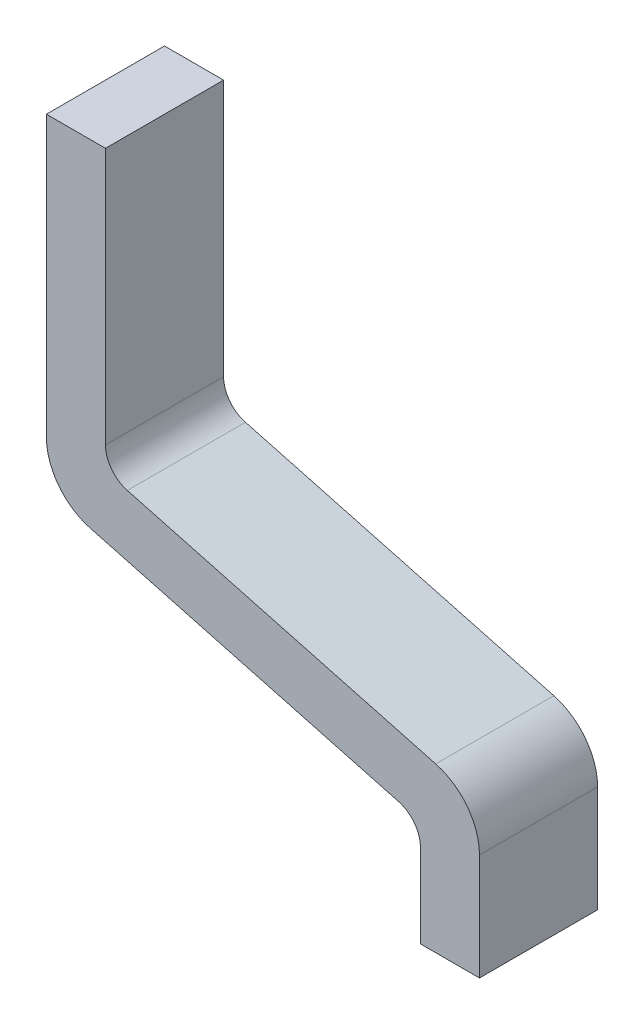
ISO-10303-21;
HEADER;
FILE_DESCRIPTION(('STEP AP214'),'2;1');
FILE_NAME('part.step','',(''),(''),'','','');
FILE_SCHEMA(('AUTOMOTIVE_DESIGN { 1 0 10303 214 1 1 1 1 }'));
ENDSEC;
DATA;
#1=APPLICATION_CONTEXT('core data for automotive mechanical design processes');
#2=APPLICATION_PROTOCOL_DEFINITION('international standard','automotive_design',2000,#1);
#3=PRODUCT_CONTEXT('',#1,'mechanical');
#4=PRODUCT('Part','Part','',(#3));
#5=PRODUCT_RELATED_PRODUCT_CATEGORY('part','',(#4));
#6=PRODUCT_DEFINITION_FORMATION('','',#4);
#7=PRODUCT_DEFINITION_CONTEXT('part definition',#1,'design');
#8=PRODUCT_DEFINITION('design','',#6,#7);
#9=PRODUCT_DEFINITION_SHAPE('','',#8);
#10=(LENGTH_UNIT() NAMED_UNIT(*) SI_UNIT(.MILLI.,.METRE.));
#11=(NAMED_UNIT(*) PLANE_ANGLE_UNIT() SI_UNIT($,.RADIAN.));
#12=(NAMED_UNIT(*) SI_UNIT($,.STERADIAN.) SOLID_ANGLE_UNIT());
#13=UNCERTAINTY_MEASURE_WITH_UNIT(LENGTH_MEASURE(1.E-05),#10,'distance_accuracy_value','');
#14=(GEOMETRIC_REPRESENTATION_CONTEXT(3) GLOBAL_UNCERTAINTY_ASSIGNED_CONTEXT((#13)) GLOBAL_UNIT_ASSIGNED_CONTEXT((#10,
#11,#12)) REPRESENTATION_CONTEXT('',''));
#15=CARTESIAN_POINT('',(0.,0.,0.));
#16=DIRECTION('',(0.,0.,1.));
#17=DIRECTION('',(1.,0.,0.));
#18=AXIS2_PLACEMENT_3D('',#15,#16,#17);
#19=CARTESIAN_POINT('',(0.45081520613395,3.16188122695582,-4.375));
#20=DIRECTION('',(0.,0.,1.));
#21=DIRECTION('',(1.,0.,0.));
#22=AXIS2_PLACEMENT_3D('',#19,#20,#21);
#23=PLANE('',#22);
#24=DIRECTION('',(0.,-1.,0.));
#25=VECTOR('',#24,1.);
#26=CARTESIAN_POINT('',(0.95,3.16188122695582,-4.375));
#27=LINE('',#26,#25);
#28=CARTESIAN_POINT('',(0.95,2.76289874309201,-4.375));
#29=VERTEX_POINT('',#28);
#30=CARTESIAN_POINT('',(0.95,2.55,-4.375));
#31=VERTEX_POINT('',#30);
#32=EDGE_CURVE('E11',#29,#31,#27,.T.);
#33=ORIENTED_EDGE('',*,*,#32,.F.);
#34=CARTESIAN_POINT('',(0.874999999999999,2.76289874309201,-4.375));
#35=DIRECTION('',(0.,0.,-1.));
#36=DIRECTION('',(1.,0.,0.));
#37=AXIS2_PLACEMENT_3D('',#34,#35,#36);
#38=CIRCLE('',#37,0.075);
#39=CARTESIAN_POINT('',(0.894411428382688,2.83534318006369,-4.375));
#40=VERTEX_POINT('',#39);
#41=EDGE_CURVE('E24',#40,#29,#38,.T.);
#42=ORIENTED_EDGE('',*,*,#41,.F.);
#43=DIRECTION('',(0.965925826289069,-0.258819045102518,0.));
#44=VECTOR('',#43,1.);
#45=CARTESIAN_POINT('',(0.111177143234622,3.04521017425348,-4.375));
#46=LINE('',#45,#44);
#47=CARTESIAN_POINT('',(0.111177143234622,3.04521017425348,-4.375));
#48=VERTEX_POINT('',#47);
#49=EDGE_CURVE('E206',#48,#40,#46,.T.);
#50=ORIENTED_EDGE('',*,*,#49,.F.);
#51=CARTESIAN_POINT('',(0.15,3.19009904819684,-4.375));
#52=DIRECTION('',(0.,0.,1.));
#53=DIRECTION('',(1.,0.,0.));
#54=AXIS2_PLACEMENT_3D('',#51,#52,#53);
#55=CIRCLE('',#54,0.15);
#56=CARTESIAN_POINT('',(0.,3.19009904819684,-4.375));
#57=VERTEX_POINT('',#56);
#58=EDGE_CURVE('E203',#57,#48,#55,.T.);
#59=ORIENTED_EDGE('',*,*,#58,.F.);
#60=DIRECTION('',(0.,-1.,0.));
#61=VECTOR('',#60,1.);
#62=CARTESIAN_POINT('',(0.,3.16188122695582,-4.375));
#63=LINE('',#62,#61);
#64=CARTESIAN_POINT('',(0.,3.9,-4.375));
#65=VERTEX_POINT('',#64);
#66=EDGE_CURVE('E200',#65,#57,#63,.T.);
#67=ORIENTED_EDGE('',*,*,#66,.F.);
#68=DIRECTION('',(-1.,0.,0.));
#69=VECTOR('',#68,1.);
#70=CARTESIAN_POINT('',(0.45081520613395,3.9,-4.375));
#71=LINE('',#70,#69);
#72=CARTESIAN_POINT('',(0.15,3.9,-4.375));
#73=VERTEX_POINT('',#72);
#74=EDGE_CURVE('E197',#73,#65,#71,.T.);
#75=ORIENTED_EDGE('',*,*,#74,.F.);
#76=DIRECTION('',(0.,1.,0.));
#77=VECTOR('',#76,1.);
#78=CARTESIAN_POINT('',(0.15,3.16188122695582,-4.375));
#79=LINE('',#78,#77);
#80=CARTESIAN_POINT('',(0.15,3.24764857229527,-4.375));
#81=VERTEX_POINT('',#80);
#82=EDGE_CURVE('E194',#81,#73,#79,.T.);
#83=ORIENTED_EDGE('',*,*,#82,.F.);
#84=CARTESIAN_POINT('',(0.225,3.24764857229527,-4.375));
#85=DIRECTION('',(0.,0.,-1.));
#86=DIRECTION('',(1.,0.,0.));
#87=AXIS2_PLACEMENT_3D('',#84,#85,#86);
#88=CIRCLE('',#87,0.075);
#89=CARTESIAN_POINT('',(0.205588571617311,3.17520413532359,-4.375));
#90=VERTEX_POINT('',#89);
#91=EDGE_CURVE('E191',#90,#81,#88,.T.);
#92=ORIENTED_EDGE('',*,*,#91,.F.);
#93=DIRECTION('',(-0.965925826289069,0.258819045102518,0.));
#94=VECTOR('',#93,1.);
#95=CARTESIAN_POINT('',(0.988822856765378,2.9653371411338,-4.375));
#96=LINE('',#95,#94);
#97=CARTESIAN_POINT('',(0.988822856765379,2.9653371411338,-4.375));
#98=VERTEX_POINT('',#97);
#99=EDGE_CURVE('E188',#98,#90,#96,.T.);
#100=ORIENTED_EDGE('',*,*,#99,.F.);
#101=CARTESIAN_POINT('',(0.95,2.82044826719043,-4.375));
#102=DIRECTION('',(0.,0.,1.));
#103=DIRECTION('',(1.,0.,0.));
#104=AXIS2_PLACEMENT_3D('',#101,#102,#103);
#105=CIRCLE('',#104,0.15);
#106=CARTESIAN_POINT('',(1.1,2.82044826719043,-4.375));
#107=VERTEX_POINT('',#106);
#108=EDGE_CURVE('E186',#107,#98,#105,.T.);
#109=ORIENTED_EDGE('',*,*,#108,.F.);
#110=DIRECTION('',(0.,1.,0.));
#111=VECTOR('',#110,1.);
#112=CARTESIAN_POINT('',(1.1,3.16188122695582,-4.375));
#113=LINE('',#112,#111);
#114=CARTESIAN_POINT('',(1.1,2.55,-4.375));
#115=VERTEX_POINT('',#114);
#116=EDGE_CURVE('E108',#115,#107,#113,.T.);
#117=ORIENTED_EDGE('',*,*,#116,.F.);
#118=DIRECTION('',(1.,0.,0.));
#119=VECTOR('',#118,1.);
#120=CARTESIAN_POINT('',(0.45081520613395,2.55,-4.375));
#121=LINE('',#120,#119);
#122=EDGE_CURVE('E182',#31,#115,#121,.T.);
#123=ORIENTED_EDGE('',*,*,#122,.F.);
#124=EDGE_LOOP('',(#33,#42,#50,#59,#67,#75,#83,#92,#100,#109,#117,#123));
#125=FACE_BOUND('',#124,.T.);
#126=ADVANCED_FACE('F17',(#125),#23,.F.);
#127=CARTESIAN_POINT('',(0.95,2.55,-4.225));
#128=DIRECTION('',(0.,-1.,0.));
#129=DIRECTION('',(0.,0.,-1.));
#130=AXIS2_PLACEMENT_3D('',#127,#128,#129);
#131=PLANE('',#130);
#132=DIRECTION('',(0.,0.,-1.));
#133=VECTOR('',#132,1.);
#134=CARTESIAN_POINT('',(0.95,2.55,-4.225));
#135=LINE('',#134,#133);
#136=CARTESIAN_POINT('',(0.95,2.55,-4.075));
#137=VERTEX_POINT('',#136);
#138=EDGE_CURVE('E179',#137,#31,#135,.T.);
#139=ORIENTED_EDGE('',*,*,#138,.T.);
#140=ORIENTED_EDGE('',*,*,#122,.T.);
#141=DIRECTION('',(0.,0.,1.));
#142=VECTOR('',#141,1.);
#143=CARTESIAN_POINT('',(1.1,2.55,-4.225));
#144=LINE('',#143,#142);
#145=CARTESIAN_POINT('',(1.1,2.55,-4.075));
#146=VERTEX_POINT('',#145);
#147=EDGE_CURVE('E177',#115,#146,#144,.T.);
#148=ORIENTED_EDGE('',*,*,#147,.T.);
#149=DIRECTION('',(-1.,0.,0.));
#150=VECTOR('',#149,1.);
#151=CARTESIAN_POINT('',(0.95,2.55,-4.075));
#152=LINE('',#151,#150);
#153=EDGE_CURVE('E127',#146,#137,#152,.T.);
#154=ORIENTED_EDGE('',*,*,#153,.T.);
#155=EDGE_LOOP('',(#139,#140,#148,#154));
#156=FACE_BOUND('',#155,.T.);
#157=ADVANCED_FACE('F235',(#156),#131,.T.);
#158=CARTESIAN_POINT('',(0.95,2.76289874309201,-4.225));
#159=DIRECTION('',(-1.,0.,0.));
#160=DIRECTION('',(0.,-1.,0.));
#161=AXIS2_PLACEMENT_3D('',#158,#159,#160);
#162=PLANE('',#161);
#163=DIRECTION('',(0.,0.,-1.));
#164=VECTOR('',#163,1.);
#165=CARTESIAN_POINT('',(0.95,2.76289874309201,-4.225));
#166=LINE('',#165,#164);
#167=CARTESIAN_POINT('',(0.95,2.76289874309201,-4.075));
#168=VERTEX_POINT('',#167);
#169=EDGE_CURVE('E174',#168,#29,#166,.T.);
#170=ORIENTED_EDGE('',*,*,#169,.T.);
#171=ORIENTED_EDGE('',*,*,#32,.T.);
#172=ORIENTED_EDGE('',*,*,#138,.F.);
#173=DIRECTION('',(0.,1.,0.));
#174=VECTOR('',#173,1.);
#175=CARTESIAN_POINT('',(0.95,2.76289874309201,-4.075));
#176=LINE('',#175,#174);
#177=EDGE_CURVE('E171',#137,#168,#176,.T.);
#178=ORIENTED_EDGE('',*,*,#177,.T.);
#179=EDGE_LOOP('',(#170,#171,#172,#178));
#180=FACE_BOUND('',#179,.T.);
#181=ADVANCED_FACE('F212',(#180),#162,.T.);
#182=CARTESIAN_POINT('',(0.874999999999999,2.76289874309201,-4.225));
#183=DIRECTION('',(0.,0.,1.));
#184=DIRECTION('',(1.,0.,0.));
#185=AXIS2_PLACEMENT_3D('',#182,#183,#184);
#186=CYLINDRICAL_SURFACE('',#185,0.075);
#187=CARTESIAN_POINT('',(0.874999999999999,2.76289874309201,-4.075));
#188=DIRECTION('',(0.,0.,-1.));
#189=DIRECTION('',(1.,0.,0.));
#190=AXIS2_PLACEMENT_3D('',#187,#188,#189);
#191=CIRCLE('',#190,0.075);
#192=CARTESIAN_POINT('',(0.894411428382688,2.83534318006369,-4.075));
#193=VERTEX_POINT('',#192);
#194=EDGE_CURVE('E169',#193,#168,#191,.T.);
#195=ORIENTED_EDGE('',*,*,#194,.F.);
#196=DIRECTION('',(0.,0.,1.));
#197=VECTOR('',#196,1.);
#198=CARTESIAN_POINT('',(0.894411428382689,2.83534318006369,-4.225));
#199=LINE('',#198,#197);
#200=EDGE_CURVE('E167',#40,#193,#199,.T.);
#201=ORIENTED_EDGE('',*,*,#200,.F.);
#202=ORIENTED_EDGE('',*,*,#41,.T.);
#203=ORIENTED_EDGE('',*,*,#169,.F.);
#204=EDGE_LOOP('',(#195,#201,#202,#203));
#205=FACE_BOUND('',#204,.T.);
#206=ADVANCED_FACE('F211',(#205),#186,.F.);
#207=CARTESIAN_POINT('',(0.111177143234622,3.04521017425348,-4.225));
#208=DIRECTION('',(-0.25881904510252,-0.965925826289068,0.));
#209=DIRECTION('',(0.965925826289068,-0.25881904510252,0.));
#210=AXIS2_PLACEMENT_3D('',#207,#208,#209);
#211=PLANE('',#210);
#212=DIRECTION('',(0.,0.,-1.));
#213=VECTOR('',#212,1.);
#214=CARTESIAN_POINT('',(0.111177143234622,3.04521017425348,-4.225));
#215=LINE('',#214,#213);
#216=CARTESIAN_POINT('',(0.111177143234622,3.04521017425348,-4.075));
#217=VERTEX_POINT('',#216);
#218=EDGE_CURVE('E164',#217,#48,#215,.T.);
#219=ORIENTED_EDGE('',*,*,#218,.T.);
#220=ORIENTED_EDGE('',*,*,#49,.T.);
#221=ORIENTED_EDGE('',*,*,#200,.T.);
#222=DIRECTION('',(-0.965925826289068,0.25881904510252,0.));
#223=VECTOR('',#222,1.);
#224=CARTESIAN_POINT('',(0.111177143234622,3.04521017425348,-4.075));
#225=LINE('',#224,#223);
#226=EDGE_CURVE('E161',#193,#217,#225,.T.);
#227=ORIENTED_EDGE('',*,*,#226,.T.);
#228=EDGE_LOOP('',(#219,#220,#221,#227));
#229=FACE_BOUND('',#228,.T.);
#230=ADVANCED_FACE('F217',(#229),#211,.T.);
#231=CARTESIAN_POINT('',(0.15,3.19009904819684,-4.225));
#232=DIRECTION('',(0.,0.,1.));
#233=DIRECTION('',(1.,0.,0.));
#234=AXIS2_PLACEMENT_3D('',#231,#232,#233);
#235=CYLINDRICAL_SURFACE('',#234,0.15);
#236=DIRECTION('',(0.,0.,-1.));
#237=VECTOR('',#236,1.);
#238=CARTESIAN_POINT('',(0.,3.19009904819684,-4.225));
#239=LINE('',#238,#237);
#240=CARTESIAN_POINT('',(0.,3.19009904819684,-4.075));
#241=VERTEX_POINT('',#240);
#242=EDGE_CURVE('E158',#241,#57,#239,.T.);
#243=ORIENTED_EDGE('',*,*,#242,.T.);
#244=ORIENTED_EDGE('',*,*,#58,.T.);
#245=ORIENTED_EDGE('',*,*,#218,.F.);
#246=CARTESIAN_POINT('',(0.15,3.19009904819684,-4.075));
#247=DIRECTION('',(0.,0.,-1.));
#248=DIRECTION('',(1.,0.,0.));
#249=AXIS2_PLACEMENT_3D('',#246,#247,#248);
#250=CIRCLE('',#249,0.15);
#251=EDGE_CURVE('E155',#217,#241,#250,.T.);
#252=ORIENTED_EDGE('',*,*,#251,.T.);
#253=EDGE_LOOP('',(#243,#244,#245,#252));
#254=FACE_BOUND('',#253,.T.);
#255=ADVANCED_FACE('F219',(#254),#235,.T.);
#256=CARTESIAN_POINT('',(0.,3.9,-4.225));
#257=DIRECTION('',(-1.,0.,0.));
#258=DIRECTION('',(0.,0.,1.));
#259=AXIS2_PLACEMENT_3D('',#256,#257,#258);
#260=PLANE('',#259);
#261=DIRECTION('',(0.,0.,-1.));
#262=VECTOR('',#261,1.);
#263=CARTESIAN_POINT('',(0.,3.9,-4.225));
#264=LINE('',#263,#262);
#265=CARTESIAN_POINT('',(0.,3.9,-4.075));
#266=VERTEX_POINT('',#265);
#267=EDGE_CURVE('E152',#266,#65,#264,.T.);
#268=ORIENTED_EDGE('',*,*,#267,.T.);
#269=ORIENTED_EDGE('',*,*,#66,.T.);
#270=ORIENTED_EDGE('',*,*,#242,.F.);
#271=DIRECTION('',(0.,1.,0.));
#272=VECTOR('',#271,1.);
#273=CARTESIAN_POINT('',(0.,3.9,-4.075));
#274=LINE('',#273,#272);
#275=EDGE_CURVE('E149',#241,#266,#274,.T.);
#276=ORIENTED_EDGE('',*,*,#275,.T.);
#277=EDGE_LOOP('',(#268,#269,#270,#276));
#278=FACE_BOUND('',#277,.T.);
#279=ADVANCED_FACE('F221',(#278),#260,.T.);
#280=CARTESIAN_POINT('',(0.15,3.9,-4.225));
#281=DIRECTION('',(0.,1.,0.));
#282=DIRECTION('',(0.,0.,1.));
#283=AXIS2_PLACEMENT_3D('',#280,#281,#282);
#284=PLANE('',#283);
#285=DIRECTION('',(0.,0.,-1.));
#286=VECTOR('',#285,1.);
#287=CARTESIAN_POINT('',(0.15,3.9,-4.225));
#288=LINE('',#287,#286);
#289=CARTESIAN_POINT('',(0.15,3.9,-4.075));
#290=VERTEX_POINT('',#289);
#291=EDGE_CURVE('E146',#290,#73,#288,.T.);
#292=ORIENTED_EDGE('',*,*,#291,.T.);
#293=ORIENTED_EDGE('',*,*,#74,.T.);
#294=ORIENTED_EDGE('',*,*,#267,.F.);
#295=DIRECTION('',(1.,0.,0.));
#296=VECTOR('',#295,1.);
#297=CARTESIAN_POINT('',(0.15,3.9,-4.075));
#298=LINE('',#297,#296);
#299=EDGE_CURVE('E143',#266,#290,#298,.T.);
#300=ORIENTED_EDGE('',*,*,#299,.T.);
#301=EDGE_LOOP('',(#292,#293,#294,#300));
#302=FACE_BOUND('',#301,.T.);
#303=ADVANCED_FACE('F224',(#302),#284,.T.);
#304=CARTESIAN_POINT('',(0.15,3.24764857229527,-4.225));
#305=DIRECTION('',(1.,0.,0.));
#306=DIRECTION('',(0.,1.,0.));
#307=AXIS2_PLACEMENT_3D('',#304,#305,#306);
#308=PLANE('',#307);
#309=DIRECTION('',(0.,0.,-1.));
#310=VECTOR('',#309,1.);
#311=CARTESIAN_POINT('',(0.15,3.24764857229527,-4.225));
#312=LINE('',#311,#310);
#313=CARTESIAN_POINT('',(0.15,3.24764857229527,-4.075));
#314=VERTEX_POINT('',#313);
#315=EDGE_CURVE('E140',#314,#81,#312,.T.);
#316=ORIENTED_EDGE('',*,*,#315,.T.);
#317=ORIENTED_EDGE('',*,*,#82,.T.);
#318=ORIENTED_EDGE('',*,*,#291,.F.);
#319=DIRECTION('',(0.,-1.,0.));
#320=VECTOR('',#319,1.);
#321=CARTESIAN_POINT('',(0.15,3.24764857229527,-4.075));
#322=LINE('',#321,#320);
#323=EDGE_CURVE('E137',#290,#314,#322,.T.);
#324=ORIENTED_EDGE('',*,*,#323,.T.);
#325=EDGE_LOOP('',(#316,#317,#318,#324));
#326=FACE_BOUND('',#325,.T.);
#327=ADVANCED_FACE('F227',(#326),#308,.T.);
#328=CARTESIAN_POINT('',(0.225,3.24764857229527,-4.225));
#329=DIRECTION('',(0.,0.,1.));
#330=DIRECTION('',(1.,0.,0.));
#331=AXIS2_PLACEMENT_3D('',#328,#329,#330);
#332=CYLINDRICAL_SURFACE('',#331,0.075);
#333=CARTESIAN_POINT('',(0.225,3.24764857229527,-4.075));
#334=DIRECTION('',(0.,0.,-1.));
#335=DIRECTION('',(1.,0.,0.));
#336=AXIS2_PLACEMENT_3D('',#333,#334,#335);
#337=CIRCLE('',#336,0.075);
#338=CARTESIAN_POINT('',(0.205588571617311,3.17520413532359,-4.075));
#339=VERTEX_POINT('',#338);
#340=EDGE_CURVE('E134',#339,#314,#337,.T.);
#341=ORIENTED_EDGE('',*,*,#340,.F.);
#342=DIRECTION('',(0.,0.,1.));
#343=VECTOR('',#342,1.);
#344=CARTESIAN_POINT('',(0.205588571617311,3.17520413532359,-4.225));
#345=LINE('',#344,#343);
#346=EDGE_CURVE('E132',#90,#339,#345,.T.);
#347=ORIENTED_EDGE('',*,*,#346,.F.);
#348=ORIENTED_EDGE('',*,*,#91,.T.);
#349=ORIENTED_EDGE('',*,*,#315,.F.);
#350=EDGE_LOOP('',(#341,#347,#348,#349));
#351=FACE_BOUND('',#350,.T.);
#352=ADVANCED_FACE('F231',(#351),#332,.F.);
#353=CARTESIAN_POINT('',(0.988822856765378,2.9653371411338,-4.225));
#354=DIRECTION('',(0.258819045102519,0.965925826289069,0.));
#355=DIRECTION('',(-0.965925826289069,0.258819045102519,0.));
#356=AXIS2_PLACEMENT_3D('',#353,#354,#355);
#357=PLANE('',#356);
#358=DIRECTION('',(0.,0.,-1.));
#359=VECTOR('',#358,1.);
#360=CARTESIAN_POINT('',(0.988822856765378,2.9653371411338,-4.225));
#361=LINE('',#360,#359);
#362=CARTESIAN_POINT('',(0.988822856765379,2.9653371411338,-4.075));
#363=VERTEX_POINT('',#362);
#364=EDGE_CURVE('E117',#363,#98,#361,.T.);
#365=ORIENTED_EDGE('',*,*,#364,.T.);
#366=ORIENTED_EDGE('',*,*,#99,.T.);
#367=ORIENTED_EDGE('',*,*,#346,.T.);
#368=DIRECTION('',(0.965925826289069,-0.258819045102519,0.));
#369=VECTOR('',#368,1.);
#370=CARTESIAN_POINT('',(0.988822856765378,2.9653371411338,-4.075));
#371=LINE('',#370,#369);
#372=EDGE_CURVE('E111',#339,#363,#371,.T.);
#373=ORIENTED_EDGE('',*,*,#372,.T.);
#374=EDGE_LOOP('',(#365,#366,#367,#373));
#375=FACE_BOUND('',#374,.T.);
#376=ADVANCED_FACE('F233',(#375),#357,.T.);
#377=CARTESIAN_POINT('',(0.95,2.82044826719043,-4.225));
#378=DIRECTION('',(0.,0.,1.));
#379=DIRECTION('',(1.,0.,0.));
#380=AXIS2_PLACEMENT_3D('',#377,#378,#379);
#381=CYLINDRICAL_SURFACE('',#380,0.15);
#382=DIRECTION('',(0.,0.,-1.));
#383=VECTOR('',#382,1.);
#384=CARTESIAN_POINT('',(1.1,2.82044826719043,-4.225));
#385=LINE('',#384,#383);
#386=CARTESIAN_POINT('',(1.1,2.82044826719043,-4.075));
#387=VERTEX_POINT('',#386);
#388=EDGE_CURVE('E102',#387,#107,#385,.T.);
#389=ORIENTED_EDGE('',*,*,#388,.T.);
#390=ORIENTED_EDGE('',*,*,#108,.T.);
#391=ORIENTED_EDGE('',*,*,#364,.F.);
#392=CARTESIAN_POINT('',(0.95,2.82044826719043,-4.075));
#393=DIRECTION('',(0.,0.,-1.));
#394=DIRECTION('',(1.,0.,0.));
#395=AXIS2_PLACEMENT_3D('',#392,#393,#394);
#396=CIRCLE('',#395,0.15);
#397=EDGE_CURVE('E112',#363,#387,#396,.T.);
#398=ORIENTED_EDGE('',*,*,#397,.T.);
#399=EDGE_LOOP('',(#389,#390,#391,#398));
#400=FACE_BOUND('',#399,.T.);
#401=ADVANCED_FACE('F115',(#400),#381,.T.);
#402=CARTESIAN_POINT('',(1.1,2.55,-4.225));
#403=DIRECTION('',(1.,0.,0.));
#404=DIRECTION('',(0.,1.,0.));
#405=AXIS2_PLACEMENT_3D('',#402,#403,#404);
#406=PLANE('',#405);
#407=ORIENTED_EDGE('',*,*,#147,.F.);
#408=ORIENTED_EDGE('',*,*,#116,.T.);
#409=ORIENTED_EDGE('',*,*,#388,.F.);
#410=DIRECTION('',(0.,-1.,0.));
#411=VECTOR('',#410,1.);
#412=CARTESIAN_POINT('',(1.1,2.55,-4.075));
#413=LINE('',#412,#411);
#414=EDGE_CURVE('E107',#387,#146,#413,.T.);
#415=ORIENTED_EDGE('',*,*,#414,.T.);
#416=EDGE_LOOP('',(#407,#408,#409,#415));
#417=FACE_BOUND('',#416,.T.);
#418=ADVANCED_FACE('F105',(#417),#406,.T.);
#419=CARTESIAN_POINT('',(0.45081520613395,3.16188122695582,-4.075));
#420=DIRECTION('',(0.,0.,1.));
#421=DIRECTION('',(1.,0.,0.));
#422=AXIS2_PLACEMENT_3D('',#419,#420,#421);
#423=PLANE('',#422);
#424=ORIENTED_EDGE('',*,*,#194,.T.);
#425=ORIENTED_EDGE('',*,*,#177,.F.);
#426=ORIENTED_EDGE('',*,*,#153,.F.);
#427=ORIENTED_EDGE('',*,*,#414,.F.);
#428=ORIENTED_EDGE('',*,*,#397,.F.);
#429=ORIENTED_EDGE('',*,*,#372,.F.);
#430=ORIENTED_EDGE('',*,*,#340,.T.);
#431=ORIENTED_EDGE('',*,*,#323,.F.);
#432=ORIENTED_EDGE('',*,*,#299,.F.);
#433=ORIENTED_EDGE('',*,*,#275,.F.);
#434=ORIENTED_EDGE('',*,*,#251,.F.);
#435=ORIENTED_EDGE('',*,*,#226,.F.);
#436=EDGE_LOOP('',(#424,#425,#426,#427,#428,#429,#430,#431,#432,#433,#434,#435));
#437=FACE_BOUND('',#436,.T.);
#438=ADVANCED_FACE('F124',(#437),#423,.T.);
#439=CLOSED_SHELL('',(#126,#157,#181,#206,#230,#255,#279,#303,#327,#352,#376,#401,#418,#438));
#440=MANIFOLD_SOLID_BREP('B1',#439);
#441=ADVANCED_BREP_SHAPE_REPRESENTATION('',(#18,#440),#14);
#442=SHAPE_DEFINITION_REPRESENTATION(#9,#441);
ENDSEC;
END-ISO-10303-21;
